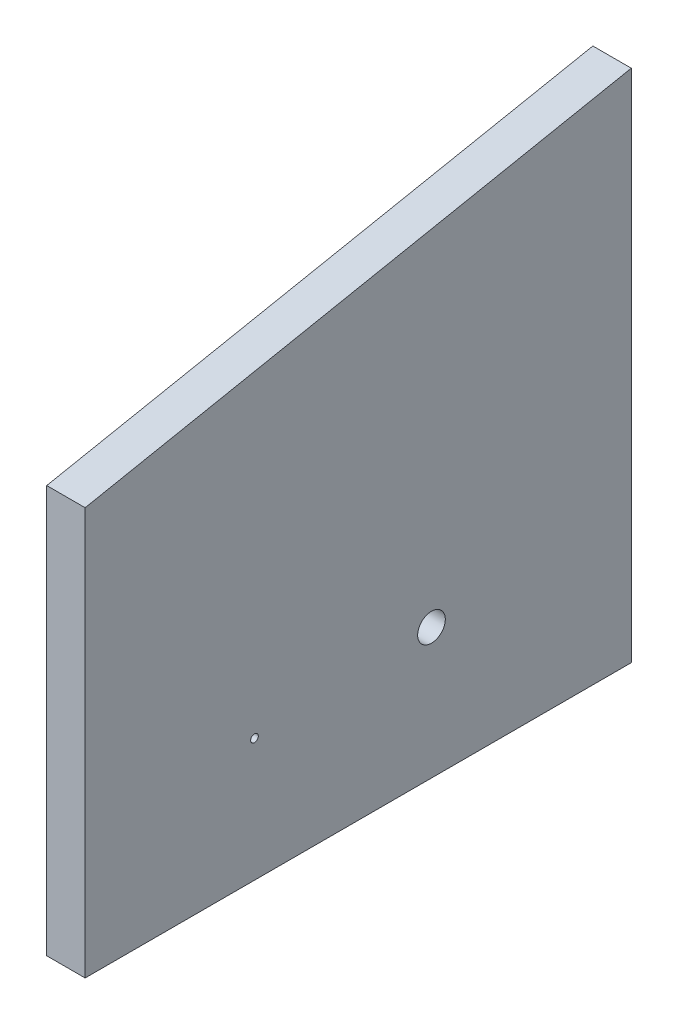
ISO-10303-21;
HEADER;
FILE_DESCRIPTION(('STEP AP214'),'2;1');
FILE_NAME('part.step','',(''),(''),'','','');
FILE_SCHEMA(('AUTOMOTIVE_DESIGN { 1 0 10303 214 1 1 1 1 }'));
ENDSEC;
DATA;
#1=APPLICATION_CONTEXT('core data for automotive mechanical design processes');
#2=APPLICATION_PROTOCOL_DEFINITION('international standard','automotive_design',2000,#1);
#3=PRODUCT_CONTEXT('',#1,'mechanical');
#4=PRODUCT('Part','Part','',(#3));
#5=PRODUCT_RELATED_PRODUCT_CATEGORY('part','',(#4));
#6=PRODUCT_DEFINITION_FORMATION('','',#4);
#7=PRODUCT_DEFINITION_CONTEXT('part definition',#1,'design');
#8=PRODUCT_DEFINITION('design','',#6,#7);
#9=PRODUCT_DEFINITION_SHAPE('','',#8);
#10=(LENGTH_UNIT() NAMED_UNIT(*) SI_UNIT(.MILLI.,.METRE.));
#11=(NAMED_UNIT(*) PLANE_ANGLE_UNIT() SI_UNIT($,.RADIAN.));
#12=(NAMED_UNIT(*) SI_UNIT($,.STERADIAN.) SOLID_ANGLE_UNIT());
#13=UNCERTAINTY_MEASURE_WITH_UNIT(LENGTH_MEASURE(1.E-05),#10,'distance_accuracy_value','');
#14=(GEOMETRIC_REPRESENTATION_CONTEXT(3) GLOBAL_UNCERTAINTY_ASSIGNED_CONTEXT((#13)) GLOBAL_UNIT_ASSIGNED_CONTEXT((#10,
#11,#12)) REPRESENTATION_CONTEXT('',''));
#15=CARTESIAN_POINT('',(0.,0.,0.));
#16=DIRECTION('',(0.,0.,1.));
#17=DIRECTION('',(1.,0.,0.));
#18=AXIS2_PLACEMENT_3D('',#15,#16,#17);
#19=CARTESIAN_POINT('',(0.,0.,0.));
#20=DIRECTION('',(0.,-1.,0.));
#21=DIRECTION('',(0.,0.,-1.));
#22=AXIS2_PLACEMENT_3D('',#19,#20,#21);
#23=PLANE('',#22);
#24=DIRECTION('',(-1.,0.,0.));
#25=VECTOR('',#24,1.);
#26=CARTESIAN_POINT('',(-8.2,0.,-17.));
#27=LINE('',#26,#25);
#28=CARTESIAN_POINT('',(-8.2,0.,-17.));
#29=VERTEX_POINT('',#28);
#30=CARTESIAN_POINT('',(-13.2,0.,-17.));
#31=VERTEX_POINT('',#30);
#32=EDGE_CURVE('E53',#29,#31,#27,.T.);
#33=ORIENTED_EDGE('',*,*,#32,.F.);
#34=DIRECTION('',(0.,0.,-1.));
#35=VECTOR('',#34,1.);
#36=CARTESIAN_POINT('',(-8.2,0.,0.));
#37=LINE('',#36,#35);
#38=CARTESIAN_POINT('',(-8.19999999999999,0.,54.07));
#39=VERTEX_POINT('',#38);
#40=EDGE_CURVE('E11',#39,#29,#37,.T.);
#41=ORIENTED_EDGE('',*,*,#40,.F.);
#42=DIRECTION('',(1.,0.,0.));
#43=VECTOR('',#42,1.);
#44=CARTESIAN_POINT('',(-13.2,0.,54.07));
#45=LINE('',#44,#43);
#46=CARTESIAN_POINT('',(-13.2,0.,54.07));
#47=VERTEX_POINT('',#46);
#48=EDGE_CURVE('E61',#47,#39,#45,.T.);
#49=ORIENTED_EDGE('',*,*,#48,.F.);
#50=DIRECTION('',(0.,0.,1.));
#51=VECTOR('',#50,1.);
#52=CARTESIAN_POINT('',(-13.2,0.,-22.));
#53=LINE('',#52,#51);
#54=EDGE_CURVE('E120',#31,#47,#53,.T.);
#55=ORIENTED_EDGE('',*,*,#54,.F.);
#56=EDGE_LOOP('',(#33,#41,#49,#55));
#57=FACE_BOUND('',#56,.T.);
#58=ADVANCED_FACE('F39',(#57),#23,.T.);
#59=CARTESIAN_POINT('',(-8.2,-18.,-22.));
#60=DIRECTION('',(-1.,0.,0.));
#61=DIRECTION('',(0.,0.,1.));
#62=AXIS2_PLACEMENT_3D('',#59,#60,#61);
#63=PLANE('',#62);
#64=CARTESIAN_POINT('',(-8.2,17.,9.00000000000001));
#65=DIRECTION('',(-1.,0.,0.));
#66=DIRECTION('',(0.,0.,1.));
#67=AXIS2_PLACEMENT_3D('',#64,#65,#66);
#68=CIRCLE('',#67,1.8);
#69=CARTESIAN_POINT('',(-8.2,17.,10.8));
#70=VERTEX_POINT('',#69);
#71=EDGE_CURVE('E46',#70,#70,#68,.T.);
#72=ORIENTED_EDGE('',*,*,#71,.T.);
#73=EDGE_LOOP('',(#72));
#74=FACE_BOUND('',#73,.T.);
#75=ORIENTED_EDGE('',*,*,#40,.T.);
#76=DIRECTION('',(0.,-1.,0.));
#77=VECTOR('',#76,1.);
#78=CARTESIAN_POINT('',(-8.2,0.,-17.));
#79=LINE('',#78,#77);
#80=CARTESIAN_POINT('',(-8.2,67.,-17.));
#81=VERTEX_POINT('',#80);
#82=EDGE_CURVE('E99',#81,#29,#79,.T.);
#83=ORIENTED_EDGE('',*,*,#82,.F.);
#84=DIRECTION('',(0.,0.1932746003453,-0.981144703324318));
#85=VECTOR('',#84,1.);
#86=CARTESIAN_POINT('',(-8.2,67.,-17.));
#87=LINE('',#86,#85);
#88=CARTESIAN_POINT('',(-8.2,53.,54.07));
#89=VERTEX_POINT('',#88);
#90=EDGE_CURVE('E92',#89,#81,#87,.T.);
#91=ORIENTED_EDGE('',*,*,#90,.F.);
#92=DIRECTION('',(0.,1.,0.));
#93=VECTOR('',#92,1.);
#94=CARTESIAN_POINT('',(-8.19999999999999,0.,54.07));
#95=LINE('',#94,#93);
#96=EDGE_CURVE('E78',#39,#89,#95,.T.);
#97=ORIENTED_EDGE('',*,*,#96,.F.);
#98=EDGE_LOOP('',(#75,#83,#91,#97));
#99=FACE_BOUND('',#98,.T.);
#100=CARTESIAN_POINT('',(-8.2,16.,32.035));
#101=DIRECTION('',(-1.,0.,0.));
#102=DIRECTION('',(0.,0.,1.));
#103=AXIS2_PLACEMENT_3D('',#100,#101,#102);
#104=CIRCLE('',#103,0.499999999999999);
#105=CARTESIAN_POINT('',(-8.2,16.,32.535));
#106=VERTEX_POINT('',#105);
#107=EDGE_CURVE('E112',#106,#106,#104,.T.);
#108=ORIENTED_EDGE('',*,*,#107,.T.);
#109=EDGE_LOOP('',(#108));
#110=FACE_BOUND('',#109,.T.);
#111=ADVANCED_FACE('F97',(#74,#99,#110),#63,.F.);
#112=CARTESIAN_POINT('',(72.8,17.,9.00000000000001));
#113=DIRECTION('',(-1.,0.,0.));
#114=DIRECTION('',(0.,0.,1.));
#115=AXIS2_PLACEMENT_3D('',#112,#113,#114);
#116=CYLINDRICAL_SURFACE('',#115,1.8);
#117=ORIENTED_EDGE('',*,*,#71,.F.);
#118=EDGE_LOOP('',(#117));
#119=FACE_BOUND('',#118,.T.);
#120=CARTESIAN_POINT('',(-13.2,17.,9.00000000000001));
#121=DIRECTION('',(-1.,0.,0.));
#122=DIRECTION('',(0.,0.,1.));
#123=AXIS2_PLACEMENT_3D('',#120,#121,#122);
#124=CIRCLE('',#123,1.8);
#125=CARTESIAN_POINT('',(-13.2,17.,10.8));
#126=VERTEX_POINT('',#125);
#127=EDGE_CURVE('E115',#126,#126,#124,.T.);
#128=ORIENTED_EDGE('',*,*,#127,.T.);
#129=EDGE_LOOP('',(#128));
#130=FACE_BOUND('',#129,.T.);
#131=ADVANCED_FACE('F125',(#119,#130),#116,.F.);
#132=CARTESIAN_POINT('',(-13.2,0.,0.));
#133=DIRECTION('',(1.,0.,0.));
#134=DIRECTION('',(0.,0.,-1.));
#135=AXIS2_PLACEMENT_3D('',#132,#133,#134);
#136=PLANE('',#135);
#137=DIRECTION('',(0.,-1.,0.));
#138=VECTOR('',#137,1.);
#139=CARTESIAN_POINT('',(-13.2,0.,54.07));
#140=LINE('',#139,#138);
#141=CARTESIAN_POINT('',(-13.2,53.,54.07));
#142=VERTEX_POINT('',#141);
#143=EDGE_CURVE('E109',#142,#47,#140,.T.);
#144=ORIENTED_EDGE('',*,*,#143,.F.);
#145=DIRECTION('',(0.,0.1932746003453,-0.981144703324318));
#146=VECTOR('',#145,1.);
#147=CARTESIAN_POINT('',(-13.2,67.,-17.));
#148=LINE('',#147,#146);
#149=CARTESIAN_POINT('',(-13.2,67.,-17.));
#150=VERTEX_POINT('',#149);
#151=EDGE_CURVE('E94',#142,#150,#148,.T.);
#152=ORIENTED_EDGE('',*,*,#151,.T.);
#153=DIRECTION('',(0.,1.,0.));
#154=VECTOR('',#153,1.);
#155=CARTESIAN_POINT('',(-13.2,0.,-17.));
#156=LINE('',#155,#154);
#157=EDGE_CURVE('E107',#31,#150,#156,.T.);
#158=ORIENTED_EDGE('',*,*,#157,.F.);
#159=ORIENTED_EDGE('',*,*,#54,.T.);
#160=EDGE_LOOP('',(#144,#152,#158,#159));
#161=FACE_BOUND('',#160,.T.);
#162=ORIENTED_EDGE('',*,*,#127,.F.);
#163=EDGE_LOOP('',(#162));
#164=FACE_BOUND('',#163,.T.);
#165=CARTESIAN_POINT('',(-13.2,16.,32.035));
#166=DIRECTION('',(-1.,0.,0.));
#167=DIRECTION('',(0.,0.,1.));
#168=AXIS2_PLACEMENT_3D('',#165,#166,#167);
#169=CIRCLE('',#168,0.499999999999999);
#170=CARTESIAN_POINT('',(-13.2,16.,32.535));
#171=VERTEX_POINT('',#170);
#172=EDGE_CURVE('E86',#171,#171,#169,.T.);
#173=ORIENTED_EDGE('',*,*,#172,.F.);
#174=EDGE_LOOP('',(#173));
#175=FACE_BOUND('',#174,.T.);
#176=ADVANCED_FACE('F128',(#161,#164,#175),#136,.F.);
#177=CARTESIAN_POINT('',(-8.2,16.,32.035));
#178=DIRECTION('',(-1.,0.,0.));
#179=DIRECTION('',(0.,0.,1.));
#180=AXIS2_PLACEMENT_3D('',#177,#178,#179);
#181=CYLINDRICAL_SURFACE('',#180,0.499999999999999);
#182=ORIENTED_EDGE('',*,*,#107,.F.);
#183=EDGE_LOOP('',(#182));
#184=FACE_BOUND('',#183,.T.);
#185=ORIENTED_EDGE('',*,*,#172,.T.);
#186=EDGE_LOOP('',(#185));
#187=FACE_BOUND('',#186,.T.);
#188=ADVANCED_FACE('F134',(#184,#187),#181,.F.);
#189=CARTESIAN_POINT('',(0.,0.,54.07));
#190=DIRECTION('',(0.,0.,-1.));
#191=DIRECTION('',(-1.,0.,0.));
#192=AXIS2_PLACEMENT_3D('',#189,#190,#191);
#193=PLANE('',#192);
#194=ORIENTED_EDGE('',*,*,#143,.T.);
#195=ORIENTED_EDGE('',*,*,#48,.T.);
#196=ORIENTED_EDGE('',*,*,#96,.T.);
#197=DIRECTION('',(-1.,0.,0.));
#198=VECTOR('',#197,1.);
#199=CARTESIAN_POINT('',(-8.2,53.,54.07));
#200=LINE('',#199,#198);
#201=EDGE_CURVE('E81',#89,#142,#200,.T.);
#202=ORIENTED_EDGE('',*,*,#201,.T.);
#203=EDGE_LOOP('',(#194,#195,#196,#202));
#204=FACE_BOUND('',#203,.T.);
#205=ADVANCED_FACE('F80',(#204),#193,.F.);
#206=CARTESIAN_POINT('',(0.,0.,-17.));
#207=DIRECTION('',(0.,0.,1.));
#208=DIRECTION('',(1.,0.,0.));
#209=AXIS2_PLACEMENT_3D('',#206,#207,#208);
#210=PLANE('',#209);
#211=ORIENTED_EDGE('',*,*,#82,.T.);
#212=ORIENTED_EDGE('',*,*,#32,.T.);
#213=ORIENTED_EDGE('',*,*,#157,.T.);
#214=DIRECTION('',(-1.,0.,0.));
#215=VECTOR('',#214,1.);
#216=CARTESIAN_POINT('',(-8.2,67.,-17.));
#217=LINE('',#216,#215);
#218=EDGE_CURVE('E95',#81,#150,#217,.T.);
#219=ORIENTED_EDGE('',*,*,#218,.F.);
#220=EDGE_LOOP('',(#211,#212,#213,#219));
#221=FACE_BOUND('',#220,.T.);
#222=ADVANCED_FACE('F146',(#221),#210,.F.);
#223=CARTESIAN_POINT('',(-8.2,67.,-17.));
#224=DIRECTION('',(0.,0.981144703324318,0.1932746003453));
#225=DIRECTION('',(0.,-0.1932746003453,0.981144703324318));
#226=AXIS2_PLACEMENT_3D('',#223,#224,#225);
#227=PLANE('',#226);
#228=ORIENTED_EDGE('',*,*,#151,.F.);
#229=ORIENTED_EDGE('',*,*,#201,.F.);
#230=ORIENTED_EDGE('',*,*,#90,.T.);
#231=ORIENTED_EDGE('',*,*,#218,.T.);
#232=EDGE_LOOP('',(#228,#229,#230,#231));
#233=FACE_BOUND('',#232,.T.);
#234=ADVANCED_FACE('F90',(#233),#227,.T.);
#235=CLOSED_SHELL('',(#58,#111,#131,#176,#188,#205,#222,#234));
#236=MANIFOLD_SOLID_BREP('B2',#235);
#237=ADVANCED_BREP_SHAPE_REPRESENTATION('',(#18,#236),#14);
#238=SHAPE_DEFINITION_REPRESENTATION(#9,#237);
ENDSEC;
END-ISO-10303-21;
